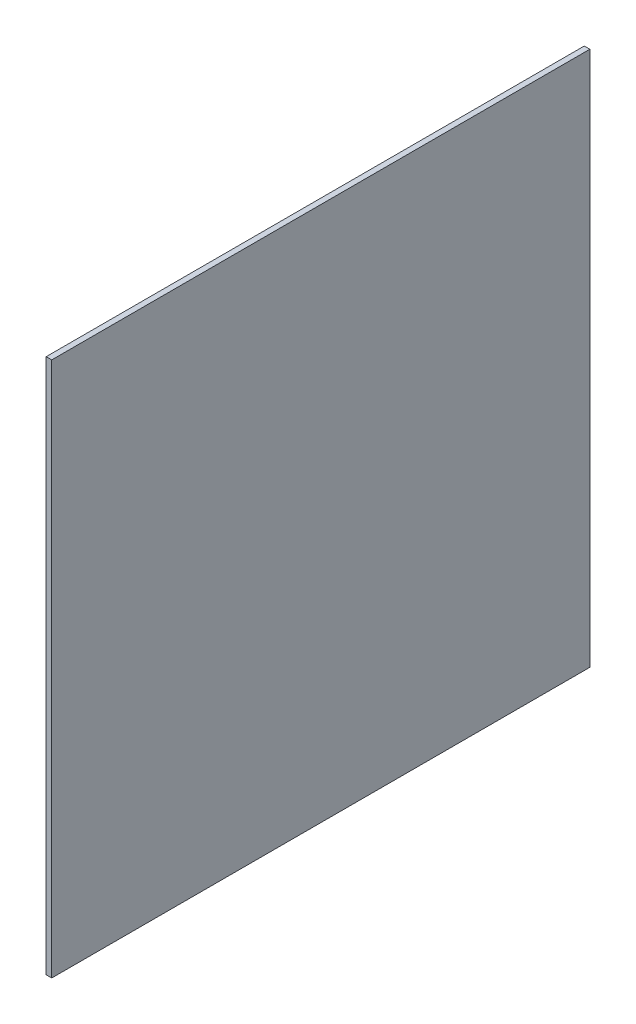
ISO-10303-21;
HEADER;
FILE_DESCRIPTION(('STEP AP214'),'2;1');
FILE_NAME('part.step','',(''),(''),'','','');
FILE_SCHEMA(('AUTOMOTIVE_DESIGN { 1 0 10303 214 1 1 1 1 }'));
ENDSEC;
DATA;
#1=APPLICATION_CONTEXT('core data for automotive mechanical design processes');
#2=APPLICATION_PROTOCOL_DEFINITION('international standard','automotive_design',2000,#1);
#3=PRODUCT_CONTEXT('',#1,'mechanical');
#4=PRODUCT('Part','Part','',(#3));
#5=PRODUCT_RELATED_PRODUCT_CATEGORY('part','',(#4));
#6=PRODUCT_DEFINITION_FORMATION('','',#4);
#7=PRODUCT_DEFINITION_CONTEXT('part definition',#1,'design');
#8=PRODUCT_DEFINITION('design','',#6,#7);
#9=PRODUCT_DEFINITION_SHAPE('','',#8);
#10=(LENGTH_UNIT() NAMED_UNIT(*) SI_UNIT(.MILLI.,.METRE.));
#11=(NAMED_UNIT(*) PLANE_ANGLE_UNIT() SI_UNIT($,.RADIAN.));
#12=(NAMED_UNIT(*) SI_UNIT($,.STERADIAN.) SOLID_ANGLE_UNIT());
#13=UNCERTAINTY_MEASURE_WITH_UNIT(LENGTH_MEASURE(1.E-05),#10,'distance_accuracy_value','');
#14=(GEOMETRIC_REPRESENTATION_CONTEXT(3) GLOBAL_UNCERTAINTY_ASSIGNED_CONTEXT((#13)) GLOBAL_UNIT_ASSIGNED_CONTEXT((#10,
#11,#12)) REPRESENTATION_CONTEXT('',''));
#15=CARTESIAN_POINT('',(0.,0.,0.));
#16=DIRECTION('',(0.,0.,1.));
#17=DIRECTION('',(1.,0.,0.));
#18=AXIS2_PLACEMENT_3D('',#15,#16,#17);
#19=CARTESIAN_POINT('',(2.,-312.52988594496,-38.2585499316005));
#20=DIRECTION('',(0.,0.,-1.));
#21=DIRECTION('',(-1.,0.,0.));
#22=AXIS2_PLACEMENT_3D('',#19,#20,#21);
#23=PLANE('',#22);
#24=DIRECTION('',(0.,-1.,0.));
#25=VECTOR('',#24,1.);
#26=CARTESIAN_POINT('',(0.,-312.52988594496,-38.2585499316005));
#27=LINE('',#26,#25);
#28=CARTESIAN_POINT('',(0.,-120.52988594496,-38.2585499316005));
#29=VERTEX_POINT('',#28);
#30=CARTESIAN_POINT('',(0.,-312.52988594496,-38.2585499316005));
#31=VERTEX_POINT('',#30);
#32=EDGE_CURVE('E95',#29,#31,#27,.T.);
#33=ORIENTED_EDGE('',*,*,#32,.T.);
#34=DIRECTION('',(-1.,0.,0.));
#35=VECTOR('',#34,1.);
#36=CARTESIAN_POINT('',(2.,-312.52988594496,-38.2585499316005));
#37=LINE('',#36,#35);
#38=CARTESIAN_POINT('',(2.,-312.52988594496,-38.2585499316005));
#39=VERTEX_POINT('',#38);
#40=EDGE_CURVE('E11',#39,#31,#37,.T.);
#41=ORIENTED_EDGE('',*,*,#40,.F.);
#42=DIRECTION('',(0.,-1.,0.));
#43=VECTOR('',#42,1.);
#44=CARTESIAN_POINT('',(2.,-312.52988594496,-38.2585499316005));
#45=LINE('',#44,#43);
#46=CARTESIAN_POINT('',(2.,-120.52988594496,-38.2585499316005));
#47=VERTEX_POINT('',#46);
#48=EDGE_CURVE('E83',#47,#39,#45,.T.);
#49=ORIENTED_EDGE('',*,*,#48,.F.);
#50=DIRECTION('',(-1.,0.,0.));
#51=VECTOR('',#50,1.);
#52=CARTESIAN_POINT('',(2.,-120.52988594496,-38.2585499316005));
#53=LINE('',#52,#51);
#54=EDGE_CURVE('E91',#47,#29,#53,.T.);
#55=ORIENTED_EDGE('',*,*,#54,.T.);
#56=EDGE_LOOP('',(#33,#41,#49,#55));
#57=FACE_BOUND('',#56,.T.);
#58=ADVANCED_FACE('F32',(#57),#23,.F.);
#59=CARTESIAN_POINT('',(2.,-312.52988594496,-231.258549931601));
#60=DIRECTION('',(0.,1.,0.));
#61=DIRECTION('',(0.,0.,1.));
#62=AXIS2_PLACEMENT_3D('',#59,#60,#61);
#63=PLANE('',#62);
#64=DIRECTION('',(0.,0.,-1.));
#65=VECTOR('',#64,1.);
#66=CARTESIAN_POINT('',(0.,-312.52988594496,-231.258549931601));
#67=LINE('',#66,#65);
#68=CARTESIAN_POINT('',(0.,-312.52988594496,-231.258549931601));
#69=VERTEX_POINT('',#68);
#70=EDGE_CURVE('E87',#31,#69,#67,.T.);
#71=ORIENTED_EDGE('',*,*,#70,.T.);
#72=DIRECTION('',(-1.,0.,0.));
#73=VECTOR('',#72,1.);
#74=CARTESIAN_POINT('',(2.,-312.52988594496,-231.258549931601));
#75=LINE('',#74,#73);
#76=CARTESIAN_POINT('',(2.,-312.52988594496,-231.258549931601));
#77=VERTEX_POINT('',#76);
#78=EDGE_CURVE('E40',#77,#69,#75,.T.);
#79=ORIENTED_EDGE('',*,*,#78,.F.);
#80=DIRECTION('',(0.,0.,-1.));
#81=VECTOR('',#80,1.);
#82=CARTESIAN_POINT('',(2.,-312.52988594496,-231.258549931601));
#83=LINE('',#82,#81);
#84=EDGE_CURVE('E78',#39,#77,#83,.T.);
#85=ORIENTED_EDGE('',*,*,#84,.F.);
#86=ORIENTED_EDGE('',*,*,#40,.T.);
#87=EDGE_LOOP('',(#71,#79,#85,#86));
#88=FACE_BOUND('',#87,.T.);
#89=ADVANCED_FACE('F86',(#88),#63,.F.);
#90=CARTESIAN_POINT('',(2.,-120.52988594496,-231.258549931601));
#91=DIRECTION('',(0.,0.,1.));
#92=DIRECTION('',(1.,0.,0.));
#93=AXIS2_PLACEMENT_3D('',#90,#91,#92);
#94=PLANE('',#93);
#95=DIRECTION('',(0.,1.,0.));
#96=VECTOR('',#95,1.);
#97=CARTESIAN_POINT('',(0.,-120.52988594496,-231.258549931601));
#98=LINE('',#97,#96);
#99=CARTESIAN_POINT('',(0.,-120.52988594496,-231.258549931601));
#100=VERTEX_POINT('',#99);
#101=EDGE_CURVE('E65',#69,#100,#98,.T.);
#102=ORIENTED_EDGE('',*,*,#101,.T.);
#103=DIRECTION('',(-1.,0.,0.));
#104=VECTOR('',#103,1.);
#105=CARTESIAN_POINT('',(2.,-120.52988594496,-231.258549931601));
#106=LINE('',#105,#104);
#107=CARTESIAN_POINT('',(2.,-120.52988594496,-231.258549931601));
#108=VERTEX_POINT('',#107);
#109=EDGE_CURVE('E88',#108,#100,#106,.T.);
#110=ORIENTED_EDGE('',*,*,#109,.F.);
#111=DIRECTION('',(0.,1.,0.));
#112=VECTOR('',#111,1.);
#113=CARTESIAN_POINT('',(2.,-120.52988594496,-231.258549931601));
#114=LINE('',#113,#112);
#115=EDGE_CURVE('E81',#77,#108,#114,.T.);
#116=ORIENTED_EDGE('',*,*,#115,.F.);
#117=ORIENTED_EDGE('',*,*,#78,.T.);
#118=EDGE_LOOP('',(#102,#110,#116,#117));
#119=FACE_BOUND('',#118,.T.);
#120=ADVANCED_FACE('F89',(#119),#94,.F.);
#121=CARTESIAN_POINT('',(2.,-120.52988594496,-38.2585499316005));
#122=DIRECTION('',(0.,-1.,0.));
#123=DIRECTION('',(0.,0.,-1.));
#124=AXIS2_PLACEMENT_3D('',#121,#122,#123);
#125=PLANE('',#124);
#126=DIRECTION('',(0.,0.,1.));
#127=VECTOR('',#126,1.);
#128=CARTESIAN_POINT('',(0.,-120.52988594496,-38.2585499316005));
#129=LINE('',#128,#127);
#130=EDGE_CURVE('E71',#100,#29,#129,.T.);
#131=ORIENTED_EDGE('',*,*,#130,.T.);
#132=ORIENTED_EDGE('',*,*,#54,.F.);
#133=DIRECTION('',(0.,0.,1.));
#134=VECTOR('',#133,1.);
#135=CARTESIAN_POINT('',(2.,-120.52988594496,-38.2585499316005));
#136=LINE('',#135,#134);
#137=EDGE_CURVE('E48',#108,#47,#136,.T.);
#138=ORIENTED_EDGE('',*,*,#137,.F.);
#139=ORIENTED_EDGE('',*,*,#109,.T.);
#140=EDGE_LOOP('',(#131,#132,#138,#139));
#141=FACE_BOUND('',#140,.T.);
#142=ADVANCED_FACE('F102',(#141),#125,.F.);
#143=CARTESIAN_POINT('',(2.,0.,0.));
#144=DIRECTION('',(-1.,0.,0.));
#145=DIRECTION('',(0.,0.,1.));
#146=AXIS2_PLACEMENT_3D('',#143,#144,#145);
#147=PLANE('',#146);
#148=ORIENTED_EDGE('',*,*,#48,.T.);
#149=ORIENTED_EDGE('',*,*,#84,.T.);
#150=ORIENTED_EDGE('',*,*,#115,.T.);
#151=ORIENTED_EDGE('',*,*,#137,.T.);
#152=EDGE_LOOP('',(#148,#149,#150,#151));
#153=FACE_BOUND('',#152,.T.);
#154=ADVANCED_FACE('F79',(#153),#147,.F.);
#155=CARTESIAN_POINT('',(0.,0.,0.));
#156=DIRECTION('',(-1.,0.,0.));
#157=DIRECTION('',(0.,0.,1.));
#158=AXIS2_PLACEMENT_3D('',#155,#156,#157);
#159=PLANE('',#158);
#160=ORIENTED_EDGE('',*,*,#32,.F.);
#161=ORIENTED_EDGE('',*,*,#130,.F.);
#162=ORIENTED_EDGE('',*,*,#101,.F.);
#163=ORIENTED_EDGE('',*,*,#70,.F.);
#164=EDGE_LOOP('',(#160,#161,#162,#163));
#165=FACE_BOUND('',#164,.T.);
#166=ADVANCED_FACE('F105',(#165),#159,.T.);
#167=CLOSED_SHELL('',(#58,#89,#120,#142,#154,#166));
#168=MANIFOLD_SOLID_BREP('B2',#167);
#169=ADVANCED_BREP_SHAPE_REPRESENTATION('',(#18,#168),#14);
#170=SHAPE_DEFINITION_REPRESENTATION(#9,#169);
ENDSEC;
END-ISO-10303-21;
